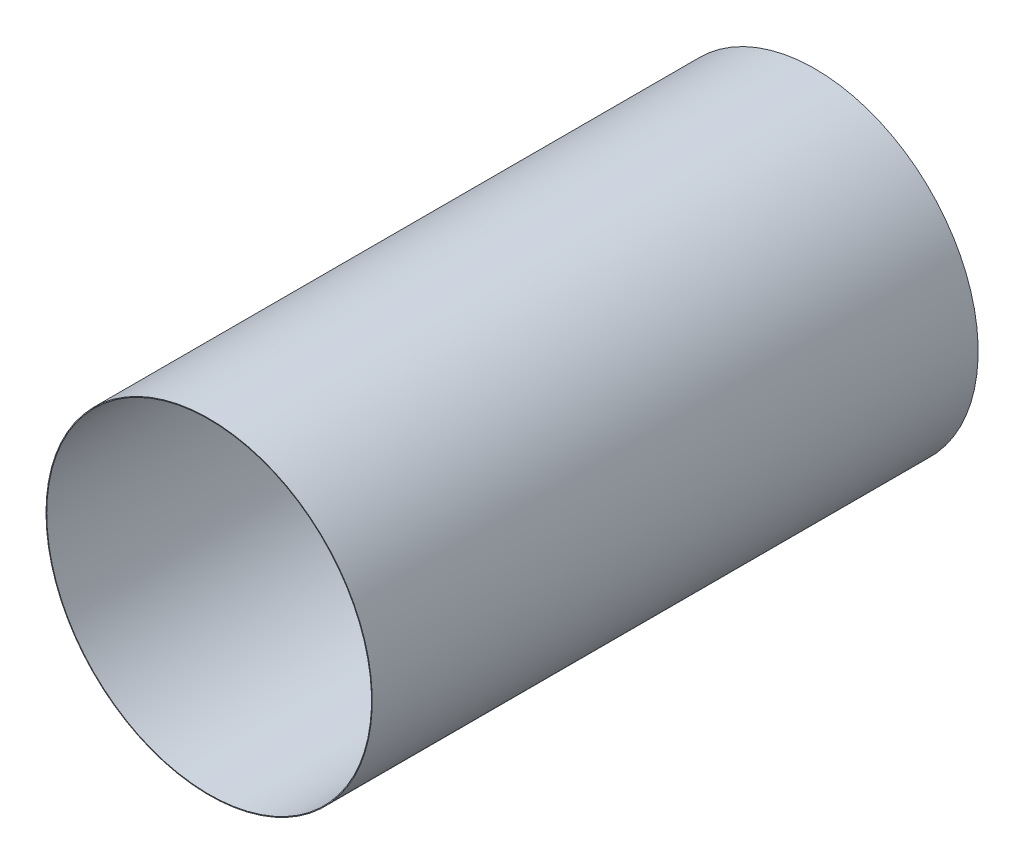
ISO-10303-21;
HEADER;
FILE_DESCRIPTION(('STEP AP214'),'2;1');
FILE_NAME('part.step','',(''),(''),'','','');
FILE_SCHEMA(('AUTOMOTIVE_DESIGN { 1 0 10303 214 1 1 1 1 }'));
ENDSEC;
DATA;
#1=APPLICATION_CONTEXT('core data for automotive mechanical design processes');
#2=APPLICATION_PROTOCOL_DEFINITION('international standard','automotive_design',2000,#1);
#3=PRODUCT_CONTEXT('',#1,'mechanical');
#4=PRODUCT('Part','Part','',(#3));
#5=PRODUCT_RELATED_PRODUCT_CATEGORY('part','',(#4));
#6=PRODUCT_DEFINITION_FORMATION('','',#4);
#7=PRODUCT_DEFINITION_CONTEXT('part definition',#1,'design');
#8=PRODUCT_DEFINITION('design','',#6,#7);
#9=PRODUCT_DEFINITION_SHAPE('','',#8);
#10=(LENGTH_UNIT() NAMED_UNIT(*) SI_UNIT(.MILLI.,.METRE.));
#11=(NAMED_UNIT(*) PLANE_ANGLE_UNIT() SI_UNIT($,.RADIAN.));
#12=(NAMED_UNIT(*) SI_UNIT($,.STERADIAN.) SOLID_ANGLE_UNIT());
#13=UNCERTAINTY_MEASURE_WITH_UNIT(LENGTH_MEASURE(1.E-05),#10,'distance_accuracy_value','');
#14=(GEOMETRIC_REPRESENTATION_CONTEXT(3) GLOBAL_UNCERTAINTY_ASSIGNED_CONTEXT((#13)) GLOBAL_UNIT_ASSIGNED_CONTEXT((#10,
#11,#12)) REPRESENTATION_CONTEXT('',''));
#15=CARTESIAN_POINT('',(0.,0.,0.));
#16=DIRECTION('',(0.,0.,1.));
#17=DIRECTION('',(1.,0.,0.));
#18=AXIS2_PLACEMENT_3D('',#15,#16,#17);
#19=CARTESIAN_POINT('',(0.,0.,0.));
#20=DIRECTION('',(0.,0.,1.));
#21=DIRECTION('',(1.,0.,0.));
#22=AXIS2_PLACEMENT_3D('',#19,#20,#21);
#23=CYLINDRICAL_SURFACE('',#22,227.5);
#24=CARTESIAN_POINT('',(0.,0.,845.));
#25=DIRECTION('',(0.,0.,1.));
#26=DIRECTION('',(1.,0.,0.));
#27=AXIS2_PLACEMENT_3D('',#24,#25,#26);
#28=CIRCLE('',#27,227.5);
#29=CARTESIAN_POINT('',(-227.5,0.,845.));
#30=VERTEX_POINT('',#29);
#31=EDGE_CURVE('E27',#30,#30,#28,.T.);
#32=ORIENTED_EDGE('',*,*,#31,.F.);
#33=DIRECTION('',(0.,0.,-1.));
#34=VECTOR('',#33,1.);
#35=CARTESIAN_POINT('',(-227.5,0.,0.));
#36=LINE('',#35,#34);
#37=CARTESIAN_POINT('',(-227.5,0.,0.));
#38=VERTEX_POINT('',#37);
#39=EDGE_CURVE('E11',#30,#38,#36,.T.);
#40=ORIENTED_EDGE('',*,*,#39,.T.);
#41=CARTESIAN_POINT('',(0.,0.,0.));
#42=DIRECTION('',(0.,0.,1.));
#43=DIRECTION('',(1.,0.,0.));
#44=AXIS2_PLACEMENT_3D('',#41,#42,#43);
#45=CIRCLE('',#44,227.5);
#46=EDGE_CURVE('E53',#38,#38,#45,.T.);
#47=ORIENTED_EDGE('',*,*,#46,.T.);
#48=ORIENTED_EDGE('',*,*,#39,.F.);
#49=EDGE_LOOP('',(#32,#40,#47,#48));
#50=FACE_BOUND('',#49,.T.);
#51=ADVANCED_FACE('F17',(#50),#23,.T.);
#52=CARTESIAN_POINT('',(0.,0.,845.));
#53=DIRECTION('',(0.,0.,1.));
#54=DIRECTION('',(1.,0.,0.));
#55=AXIS2_PLACEMENT_3D('',#52,#53,#54);
#56=PLANE('',#55);
#57=CARTESIAN_POINT('',(0.,0.,845.));
#58=DIRECTION('',(0.,0.,-1.));
#59=DIRECTION('',(1.,0.,0.));
#60=AXIS2_PLACEMENT_3D('',#57,#58,#59);
#61=CIRCLE('',#60,226.5);
#62=CARTESIAN_POINT('',(-226.5,0.,845.));
#63=VERTEX_POINT('',#62);
#64=EDGE_CURVE('E21',#63,#63,#61,.T.);
#65=ORIENTED_EDGE('',*,*,#64,.T.);
#66=EDGE_LOOP('',(#65));
#67=FACE_BOUND('',#66,.T.);
#68=ORIENTED_EDGE('',*,*,#31,.T.);
#69=EDGE_LOOP('',(#68));
#70=FACE_BOUND('',#69,.T.);
#71=ADVANCED_FACE('F19',(#67,#70),#56,.T.);
#72=CARTESIAN_POINT('',(0.,0.,0.));
#73=DIRECTION('',(0.,0.,1.));
#74=DIRECTION('',(1.,0.,0.));
#75=AXIS2_PLACEMENT_3D('',#72,#73,#74);
#76=CYLINDRICAL_SURFACE('',#75,226.5);
#77=CARTESIAN_POINT('',(0.,0.,0.));
#78=DIRECTION('',(0.,0.,-1.));
#79=DIRECTION('',(1.,0.,0.));
#80=AXIS2_PLACEMENT_3D('',#77,#78,#79);
#81=CIRCLE('',#80,226.5);
#82=CARTESIAN_POINT('',(-226.5,0.,0.));
#83=VERTEX_POINT('',#82);
#84=EDGE_CURVE('E64',#83,#83,#81,.T.);
#85=ORIENTED_EDGE('',*,*,#84,.T.);
#86=DIRECTION('',(0.,0.,1.));
#87=VECTOR('',#86,1.);
#88=CARTESIAN_POINT('',(-226.5,0.,0.));
#89=LINE('',#88,#87);
#90=EDGE_CURVE('E61',#83,#63,#89,.T.);
#91=ORIENTED_EDGE('',*,*,#90,.T.);
#92=ORIENTED_EDGE('',*,*,#64,.F.);
#93=ORIENTED_EDGE('',*,*,#90,.F.);
#94=EDGE_LOOP('',(#85,#91,#92,#93));
#95=FACE_BOUND('',#94,.T.);
#96=ADVANCED_FACE('F73',(#95),#76,.F.);
#97=CARTESIAN_POINT('',(0.,0.,0.));
#98=DIRECTION('',(0.,0.,1.));
#99=DIRECTION('',(1.,0.,0.));
#100=AXIS2_PLACEMENT_3D('',#97,#98,#99);
#101=PLANE('',#100);
#102=ORIENTED_EDGE('',*,*,#84,.F.);
#103=EDGE_LOOP('',(#102));
#104=FACE_BOUND('',#103,.T.);
#105=ORIENTED_EDGE('',*,*,#46,.F.);
#106=EDGE_LOOP('',(#105));
#107=FACE_BOUND('',#106,.T.);
#108=ADVANCED_FACE('F76',(#104,#107),#101,.F.);
#109=CLOSED_SHELL('',(#51,#71,#96,#108));
#110=MANIFOLD_SOLID_BREP('B1',#109);
#111=ADVANCED_BREP_SHAPE_REPRESENTATION('',(#18,#110),#14);
#112=SHAPE_DEFINITION_REPRESENTATION(#9,#111);
ENDSEC;
END-ISO-10303-21;
